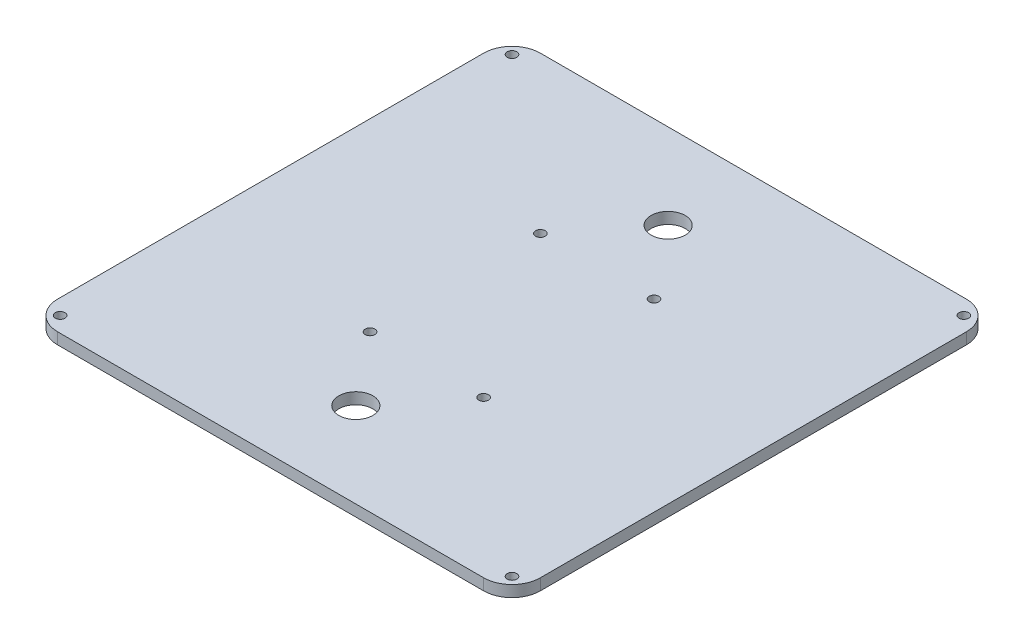
ISO-10303-21;
HEADER;
FILE_DESCRIPTION(('STEP AP214'),'2;1');
FILE_NAME('part.step','',(''),(''),'','','');
FILE_SCHEMA(('AUTOMOTIVE_DESIGN { 1 0 10303 214 1 1 1 1 }'));
ENDSEC;
DATA;
#1=APPLICATION_CONTEXT('core data for automotive mechanical design processes');
#2=APPLICATION_PROTOCOL_DEFINITION('international standard','automotive_design',2000,#1);
#3=PRODUCT_CONTEXT('',#1,'mechanical');
#4=PRODUCT('Part','Part','',(#3));
#5=PRODUCT_RELATED_PRODUCT_CATEGORY('part','',(#4));
#6=PRODUCT_DEFINITION_FORMATION('','',#4);
#7=PRODUCT_DEFINITION_CONTEXT('part definition',#1,'design');
#8=PRODUCT_DEFINITION('design','',#6,#7);
#9=PRODUCT_DEFINITION_SHAPE('','',#8);
#10=(LENGTH_UNIT() NAMED_UNIT(*) SI_UNIT(.MILLI.,.METRE.));
#11=(NAMED_UNIT(*) PLANE_ANGLE_UNIT() SI_UNIT($,.RADIAN.));
#12=(NAMED_UNIT(*) SI_UNIT($,.STERADIAN.) SOLID_ANGLE_UNIT());
#13=UNCERTAINTY_MEASURE_WITH_UNIT(LENGTH_MEASURE(1.E-05),#10,'distance_accuracy_value','');
#14=(GEOMETRIC_REPRESENTATION_CONTEXT(3) GLOBAL_UNCERTAINTY_ASSIGNED_CONTEXT((#13)) GLOBAL_UNIT_ASSIGNED_CONTEXT((#10,
#11,#12)) REPRESENTATION_CONTEXT('',''));
#15=CARTESIAN_POINT('',(0.,0.,0.));
#16=DIRECTION('',(0.,0.,1.));
#17=DIRECTION('',(1.,0.,0.));
#18=AXIS2_PLACEMENT_3D('',#15,#16,#17);
#19=CARTESIAN_POINT('',(7.4,110.,-162.6));
#20=DIRECTION('',(-1.,0.,0.));
#21=DIRECTION('',(0.,0.,1.));
#22=AXIS2_PLACEMENT_3D('',#19,#20,#21);
#23=PLANE('',#22);
#24=DIRECTION('',(0.,0.,1.));
#25=VECTOR('',#24,1.);
#26=CARTESIAN_POINT('',(7.4,110.,-162.6));
#27=LINE('',#26,#25);
#28=CARTESIAN_POINT('',(7.4,110.,-162.6));
#29=VERTEX_POINT('',#28);
#30=CARTESIAN_POINT('',(7.4,110.,-7.4));
#31=VERTEX_POINT('',#30);
#32=EDGE_CURVE('E231',#29,#31,#27,.T.);
#33=ORIENTED_EDGE('',*,*,#32,.T.);
#34=DIRECTION('',(0.,-1.,0.));
#35=VECTOR('',#34,1.);
#36=CARTESIAN_POINT('',(7.4,110.,-7.4));
#37=LINE('',#36,#35);
#38=CARTESIAN_POINT('',(7.4,107.,-7.4));
#39=VERTEX_POINT('',#38);
#40=EDGE_CURVE('E39',#31,#39,#37,.T.);
#41=ORIENTED_EDGE('',*,*,#40,.T.);
#42=DIRECTION('',(0.,0.,1.));
#43=VECTOR('',#42,1.);
#44=CARTESIAN_POINT('',(7.4,107.,-162.6));
#45=LINE('',#44,#43);
#46=CARTESIAN_POINT('',(7.4,107.,-162.6));
#47=VERTEX_POINT('',#46);
#48=EDGE_CURVE('E220',#47,#39,#45,.T.);
#49=ORIENTED_EDGE('',*,*,#48,.F.);
#50=DIRECTION('',(0.,-1.,0.));
#51=VECTOR('',#50,1.);
#52=CARTESIAN_POINT('',(7.4,110.,-162.6));
#53=LINE('',#52,#51);
#54=EDGE_CURVE('E11',#29,#47,#53,.T.);
#55=ORIENTED_EDGE('',*,*,#54,.F.);
#56=EDGE_LOOP('',(#33,#41,#49,#55));
#57=FACE_BOUND('',#56,.T.);
#58=ADVANCED_FACE('F17',(#57),#23,.F.);
#59=CARTESIAN_POINT('',(162.6,110.,-162.6));
#60=DIRECTION('',(0.,0.,-1.));
#61=DIRECTION('',(-1.,0.,0.));
#62=AXIS2_PLACEMENT_3D('',#59,#60,#61);
#63=PLANE('',#62);
#64=DIRECTION('',(-1.,0.,0.));
#65=VECTOR('',#64,1.);
#66=CARTESIAN_POINT('',(162.6,110.,-162.6));
#67=LINE('',#66,#65);
#68=CARTESIAN_POINT('',(162.6,110.,-162.6));
#69=VERTEX_POINT('',#68);
#70=EDGE_CURVE('E221',#69,#29,#67,.T.);
#71=ORIENTED_EDGE('',*,*,#70,.T.);
#72=ORIENTED_EDGE('',*,*,#54,.T.);
#73=DIRECTION('',(-1.,0.,0.));
#74=VECTOR('',#73,1.);
#75=CARTESIAN_POINT('',(162.6,107.,-162.6));
#76=LINE('',#75,#74);
#77=CARTESIAN_POINT('',(162.6,107.,-162.6));
#78=VERTEX_POINT('',#77);
#79=EDGE_CURVE('E216',#78,#47,#76,.T.);
#80=ORIENTED_EDGE('',*,*,#79,.F.);
#81=DIRECTION('',(0.,-1.,0.));
#82=VECTOR('',#81,1.);
#83=CARTESIAN_POINT('',(162.6,110.,-162.6));
#84=LINE('',#83,#82);
#85=EDGE_CURVE('E27',#69,#78,#84,.T.);
#86=ORIENTED_EDGE('',*,*,#85,.F.);
#87=EDGE_LOOP('',(#71,#72,#80,#86));
#88=FACE_BOUND('',#87,.T.);
#89=ADVANCED_FACE('F904',(#88),#63,.F.);
#90=CARTESIAN_POINT('',(162.6,110.,-7.4));
#91=DIRECTION('',(1.,0.,0.));
#92=DIRECTION('',(0.,1.,0.));
#93=AXIS2_PLACEMENT_3D('',#90,#91,#92);
#94=PLANE('',#93);
#95=DIRECTION('',(0.,0.,-1.));
#96=VECTOR('',#95,1.);
#97=CARTESIAN_POINT('',(162.6,110.,-7.4));
#98=LINE('',#97,#96);
#99=CARTESIAN_POINT('',(162.6,110.,-7.4));
#100=VERTEX_POINT('',#99);
#101=EDGE_CURVE('E223',#100,#69,#98,.T.);
#102=ORIENTED_EDGE('',*,*,#101,.T.);
#103=ORIENTED_EDGE('',*,*,#85,.T.);
#104=DIRECTION('',(0.,0.,-1.));
#105=VECTOR('',#104,1.);
#106=CARTESIAN_POINT('',(162.6,107.,-7.4));
#107=LINE('',#106,#105);
#108=CARTESIAN_POINT('',(162.6,107.,-7.4));
#109=VERTEX_POINT('',#108);
#110=EDGE_CURVE('E215',#109,#78,#107,.T.);
#111=ORIENTED_EDGE('',*,*,#110,.F.);
#112=DIRECTION('',(0.,-1.,0.));
#113=VECTOR('',#112,1.);
#114=CARTESIAN_POINT('',(162.6,110.,-7.4));
#115=LINE('',#114,#113);
#116=EDGE_CURVE('E62',#100,#109,#115,.T.);
#117=ORIENTED_EDGE('',*,*,#116,.F.);
#118=EDGE_LOOP('',(#102,#103,#111,#117));
#119=FACE_BOUND('',#118,.T.);
#120=ADVANCED_FACE('F907',(#119),#94,.F.);
#121=CARTESIAN_POINT('',(7.4,110.,-7.4));
#122=DIRECTION('',(0.,0.,1.));
#123=DIRECTION('',(0.,-1.,0.));
#124=AXIS2_PLACEMENT_3D('',#121,#122,#123);
#125=PLANE('',#124);
#126=DIRECTION('',(1.,0.,0.));
#127=VECTOR('',#126,1.);
#128=CARTESIAN_POINT('',(7.4,110.,-7.4));
#129=LINE('',#128,#127);
#130=EDGE_CURVE('E229',#31,#100,#129,.T.);
#131=ORIENTED_EDGE('',*,*,#130,.T.);
#132=ORIENTED_EDGE('',*,*,#116,.T.);
#133=DIRECTION('',(1.,0.,0.));
#134=VECTOR('',#133,1.);
#135=CARTESIAN_POINT('',(7.4,107.,-7.4));
#136=LINE('',#135,#134);
#137=EDGE_CURVE('E222',#39,#109,#136,.T.);
#138=ORIENTED_EDGE('',*,*,#137,.F.);
#139=ORIENTED_EDGE('',*,*,#40,.F.);
#140=EDGE_LOOP('',(#131,#132,#138,#139));
#141=FACE_BOUND('',#140,.T.);
#142=ADVANCED_FACE('F920',(#141),#125,.F.);
#143=CARTESIAN_POINT('',(85.,110.,-85.));
#144=DIRECTION('',(0.,1.,0.));
#145=DIRECTION('',(0.,0.,-1.));
#146=AXIS2_PLACEMENT_3D('',#143,#144,#145);
#147=PLANE('',#146);
#148=CARTESIAN_POINT('',(85.,110.,-140.));
#149=DIRECTION('',(0.,-1.,0.));
#150=DIRECTION('',(1.,0.,0.));
#151=AXIS2_PLACEMENT_3D('',#148,#149,#150);
#152=CIRCLE('',#151,6.);
#153=CARTESIAN_POINT('',(91.,110.,-140.));
#154=VERTEX_POINT('',#153);
#155=EDGE_CURVE('E206',#154,#154,#152,.T.);
#156=ORIENTED_EDGE('',*,*,#155,.F.);
#157=EDGE_LOOP('',(#156));
#158=FACE_BOUND('',#157,.T.);
#159=CARTESIAN_POINT('',(105.,110.,-115.));
#160=DIRECTION('',(0.,1.,0.));
#161=DIRECTION('',(1.,0.,0.));
#162=AXIS2_PLACEMENT_3D('',#159,#160,#161);
#163=CIRCLE('',#162,1.7);
#164=CARTESIAN_POINT('',(106.7,110.,-115.));
#165=VERTEX_POINT('',#164);
#166=EDGE_CURVE('E209',#165,#165,#163,.T.);
#167=ORIENTED_EDGE('',*,*,#166,.T.);
#168=EDGE_LOOP('',(#167));
#169=FACE_BOUND('',#168,.T.);
#170=CARTESIAN_POINT('',(65.,110.,-115.));
#171=DIRECTION('',(0.,1.,0.));
#172=DIRECTION('',(1.,0.,0.));
#173=AXIS2_PLACEMENT_3D('',#170,#171,#172);
#174=CIRCLE('',#173,1.7);
#175=CARTESIAN_POINT('',(66.7,110.,-115.));
#176=VERTEX_POINT('',#175);
#177=EDGE_CURVE('E200',#176,#176,#174,.T.);
#178=ORIENTED_EDGE('',*,*,#177,.T.);
#179=EDGE_LOOP('',(#178));
#180=FACE_BOUND('',#179,.T.);
#181=CARTESIAN_POINT('',(105.,110.,-55.));
#182=DIRECTION('',(0.,1.,0.));
#183=DIRECTION('',(1.,0.,0.));
#184=AXIS2_PLACEMENT_3D('',#181,#182,#183);
#185=CIRCLE('',#184,1.7);
#186=CARTESIAN_POINT('',(106.7,110.,-55.));
#187=VERTEX_POINT('',#186);
#188=EDGE_CURVE('E184',#187,#187,#185,.T.);
#189=ORIENTED_EDGE('',*,*,#188,.T.);
#190=EDGE_LOOP('',(#189));
#191=FACE_BOUND('',#190,.T.);
#192=CARTESIAN_POINT('',(85.,110.,-30.));
#193=DIRECTION('',(0.,-1.,0.));
#194=DIRECTION('',(1.,0.,0.));
#195=AXIS2_PLACEMENT_3D('',#192,#193,#194);
#196=CIRCLE('',#195,6.);
#197=CARTESIAN_POINT('',(91.,110.,-30.));
#198=VERTEX_POINT('',#197);
#199=EDGE_CURVE('E393',#198,#198,#196,.T.);
#200=ORIENTED_EDGE('',*,*,#199,.F.);
#201=EDGE_LOOP('',(#200));
#202=FACE_BOUND('',#201,.T.);
#203=CARTESIAN_POINT('',(65.,110.,-55.));
#204=DIRECTION('',(0.,1.,0.));
#205=DIRECTION('',(1.,0.,0.));
#206=AXIS2_PLACEMENT_3D('',#203,#204,#205);
#207=CIRCLE('',#206,1.7);
#208=CARTESIAN_POINT('',(66.7,110.,-55.));
#209=VERTEX_POINT('',#208);
#210=EDGE_CURVE('E179',#209,#209,#207,.T.);
#211=ORIENTED_EDGE('',*,*,#210,.T.);
#212=EDGE_LOOP('',(#211));
#213=FACE_BOUND('',#212,.T.);
#214=ORIENTED_EDGE('',*,*,#70,.F.);
#215=ORIENTED_EDGE('',*,*,#101,.F.);
#216=ORIENTED_EDGE('',*,*,#130,.F.);
#217=ORIENTED_EDGE('',*,*,#32,.F.);
#218=EDGE_LOOP('',(#214,#215,#216,#217));
#219=FACE_BOUND('',#218,.T.);
#220=ADVANCED_FACE('F186',(#158,#169,#180,#191,#202,#213,#219),#147,.F.);
#221=CARTESIAN_POINT('',(85.,107.,-85.));
#222=DIRECTION('',(0.,1.,0.));
#223=DIRECTION('',(0.,0.,-1.));
#224=AXIS2_PLACEMENT_3D('',#221,#222,#223);
#225=PLANE('',#224);
#226=ORIENTED_EDGE('',*,*,#110,.T.);
#227=ORIENTED_EDGE('',*,*,#79,.T.);
#228=ORIENTED_EDGE('',*,*,#48,.T.);
#229=ORIENTED_EDGE('',*,*,#137,.T.);
#230=EDGE_LOOP('',(#226,#227,#228,#229));
#231=FACE_BOUND('',#230,.T.);
#232=CARTESIAN_POINT('',(11.4,107.,-11.4));
#233=DIRECTION('',(0.,-1.,0.));
#234=DIRECTION('',(0.,0.,-1.));
#235=AXIS2_PLACEMENT_3D('',#232,#233,#234);
#236=CIRCLE('',#235,6.);
#237=CARTESIAN_POINT('',(11.4,107.,-5.4));
#238=VERTEX_POINT('',#237);
#239=CARTESIAN_POINT('',(5.4,107.,-11.4));
#240=VERTEX_POINT('',#239);
#241=EDGE_CURVE('E363',#238,#240,#236,.T.);
#242=ORIENTED_EDGE('',*,*,#241,.T.);
#243=DIRECTION('',(0.,0.,1.));
#244=VECTOR('',#243,1.);
#245=CARTESIAN_POINT('',(5.4,107.,-164.6));
#246=LINE('',#245,#244);
#247=CARTESIAN_POINT('',(5.4,107.,-158.6));
#248=VERTEX_POINT('',#247);
#249=EDGE_CURVE('E366',#248,#240,#246,.T.);
#250=ORIENTED_EDGE('',*,*,#249,.F.);
#251=CARTESIAN_POINT('',(11.4,107.,-158.6));
#252=DIRECTION('',(0.,1.,0.));
#253=DIRECTION('',(0.,0.,-1.));
#254=AXIS2_PLACEMENT_3D('',#251,#252,#253);
#255=CIRCLE('',#254,6.);
#256=CARTESIAN_POINT('',(11.4,107.,-164.6));
#257=VERTEX_POINT('',#256);
#258=EDGE_CURVE('E378',#257,#248,#255,.T.);
#259=ORIENTED_EDGE('',*,*,#258,.F.);
#260=DIRECTION('',(-1.,0.,0.));
#261=VECTOR('',#260,1.);
#262=CARTESIAN_POINT('',(164.6,107.,-164.6));
#263=LINE('',#262,#261);
#264=CARTESIAN_POINT('',(158.6,107.,-164.6));
#265=VERTEX_POINT('',#264);
#266=EDGE_CURVE('E272',#265,#257,#263,.T.);
#267=ORIENTED_EDGE('',*,*,#266,.F.);
#268=CARTESIAN_POINT('',(158.6,107.,-158.6));
#269=DIRECTION('',(0.,1.,0.));
#270=DIRECTION('',(0.,0.,-1.));
#271=AXIS2_PLACEMENT_3D('',#268,#269,#270);
#272=CIRCLE('',#271,6.);
#273=CARTESIAN_POINT('',(164.6,107.,-158.6));
#274=VERTEX_POINT('',#273);
#275=EDGE_CURVE('E381',#274,#265,#272,.T.);
#276=ORIENTED_EDGE('',*,*,#275,.F.);
#277=DIRECTION('',(0.,0.,-1.));
#278=VECTOR('',#277,1.);
#279=CARTESIAN_POINT('',(164.6,107.,-5.4));
#280=LINE('',#279,#278);
#281=CARTESIAN_POINT('',(164.6,107.,-11.4));
#282=VERTEX_POINT('',#281);
#283=EDGE_CURVE('E369',#282,#274,#280,.T.);
#284=ORIENTED_EDGE('',*,*,#283,.F.);
#285=CARTESIAN_POINT('',(158.6,107.,-11.4));
#286=DIRECTION('',(0.,1.,0.));
#287=DIRECTION('',(0.,0.,-1.));
#288=AXIS2_PLACEMENT_3D('',#285,#286,#287);
#289=CIRCLE('',#288,6.);
#290=CARTESIAN_POINT('',(158.6,107.,-5.4));
#291=VERTEX_POINT('',#290);
#292=EDGE_CURVE('E292',#291,#282,#289,.T.);
#293=ORIENTED_EDGE('',*,*,#292,.F.);
#294=DIRECTION('',(1.,0.,0.));
#295=VECTOR('',#294,1.);
#296=CARTESIAN_POINT('',(5.4,107.,-5.4));
#297=LINE('',#296,#295);
#298=EDGE_CURVE('E338',#238,#291,#297,.T.);
#299=ORIENTED_EDGE('',*,*,#298,.F.);
#300=EDGE_LOOP('',(#242,#250,#259,#267,#276,#284,#293,#299));
#301=FACE_BOUND('',#300,.T.);
#302=ADVANCED_FACE('F922',(#231,#301),#225,.F.);
#303=CARTESIAN_POINT('',(105.,110.,-115.));
#304=DIRECTION('',(0.,-1.,0.));
#305=DIRECTION('',(1.,0.,0.));
#306=AXIS2_PLACEMENT_3D('',#303,#304,#305);
#307=CYLINDRICAL_SURFACE('',#306,1.7);
#308=DIRECTION('',(0.,1.,0.));
#309=VECTOR('',#308,1.);
#310=CARTESIAN_POINT('',(106.7,110.,-115.));
#311=LINE('',#310,#309);
#312=CARTESIAN_POINT('',(106.7,114.,-115.));
#313=VERTEX_POINT('',#312);
#314=EDGE_CURVE('E210',#165,#313,#311,.T.);
#315=ORIENTED_EDGE('',*,*,#314,.T.);
#316=CARTESIAN_POINT('',(105.,114.,-115.));
#317=DIRECTION('',(0.,1.,0.));
#318=DIRECTION('',(1.,0.,0.));
#319=AXIS2_PLACEMENT_3D('',#316,#317,#318);
#320=CIRCLE('',#319,1.7);
#321=EDGE_CURVE('E328',#313,#313,#320,.T.);
#322=ORIENTED_EDGE('',*,*,#321,.T.);
#323=ORIENTED_EDGE('',*,*,#314,.F.);
#324=ORIENTED_EDGE('',*,*,#166,.F.);
#325=EDGE_LOOP('',(#315,#322,#323,#324));
#326=FACE_BOUND('',#325,.T.);
#327=ADVANCED_FACE('F948',(#326),#307,.F.);
#328=CARTESIAN_POINT('',(85.,107.,-140.));
#329=DIRECTION('',(0.,-1.,0.));
#330=DIRECTION('',(1.,0.,0.));
#331=AXIS2_PLACEMENT_3D('',#328,#329,#330);
#332=CYLINDRICAL_SURFACE('',#331,6.);
#333=ORIENTED_EDGE('',*,*,#155,.T.);
#334=DIRECTION('',(0.,1.,0.));
#335=VECTOR('',#334,1.);
#336=CARTESIAN_POINT('',(91.,107.,-140.));
#337=LINE('',#336,#335);
#338=CARTESIAN_POINT('',(91.,114.,-140.));
#339=VERTEX_POINT('',#338);
#340=EDGE_CURVE('E211',#154,#339,#337,.T.);
#341=ORIENTED_EDGE('',*,*,#340,.T.);
#342=CARTESIAN_POINT('',(85.,114.,-140.));
#343=DIRECTION('',(0.,1.,0.));
#344=DIRECTION('',(1.,0.,0.));
#345=AXIS2_PLACEMENT_3D('',#342,#343,#344);
#346=CIRCLE('',#345,6.);
#347=EDGE_CURVE('E324',#339,#339,#346,.T.);
#348=ORIENTED_EDGE('',*,*,#347,.T.);
#349=ORIENTED_EDGE('',*,*,#340,.F.);
#350=EDGE_LOOP('',(#333,#341,#348,#349));
#351=FACE_BOUND('',#350,.T.);
#352=ADVANCED_FACE('F753',(#351),#332,.F.);
#353=CARTESIAN_POINT('',(65.,110.,-115.));
#354=DIRECTION('',(0.,-1.,0.));
#355=DIRECTION('',(1.,0.,0.));
#356=AXIS2_PLACEMENT_3D('',#353,#354,#355);
#357=CYLINDRICAL_SURFACE('',#356,1.7);
#358=DIRECTION('',(0.,1.,0.));
#359=VECTOR('',#358,1.);
#360=CARTESIAN_POINT('',(66.7,110.,-115.));
#361=LINE('',#360,#359);
#362=CARTESIAN_POINT('',(66.7,114.,-115.));
#363=VERTEX_POINT('',#362);
#364=EDGE_CURVE('E191',#176,#363,#361,.T.);
#365=ORIENTED_EDGE('',*,*,#364,.T.);
#366=CARTESIAN_POINT('',(65.,114.,-115.));
#367=DIRECTION('',(0.,1.,0.));
#368=DIRECTION('',(1.,0.,0.));
#369=AXIS2_PLACEMENT_3D('',#366,#367,#368);
#370=CIRCLE('',#369,1.7);
#371=EDGE_CURVE('E320',#363,#363,#370,.T.);
#372=ORIENTED_EDGE('',*,*,#371,.T.);
#373=ORIENTED_EDGE('',*,*,#364,.F.);
#374=ORIENTED_EDGE('',*,*,#177,.F.);
#375=EDGE_LOOP('',(#365,#372,#373,#374));
#376=FACE_BOUND('',#375,.T.);
#377=ADVANCED_FACE('F942',(#376),#357,.F.);
#378=CARTESIAN_POINT('',(105.,110.,-55.));
#379=DIRECTION('',(0.,-1.,0.));
#380=DIRECTION('',(1.,0.,0.));
#381=AXIS2_PLACEMENT_3D('',#378,#379,#380);
#382=CYLINDRICAL_SURFACE('',#381,1.7);
#383=DIRECTION('',(0.,1.,0.));
#384=VECTOR('',#383,1.);
#385=CARTESIAN_POINT('',(106.7,110.,-55.));
#386=LINE('',#385,#384);
#387=CARTESIAN_POINT('',(106.7,114.,-55.));
#388=VERTEX_POINT('',#387);
#389=EDGE_CURVE('E195',#187,#388,#386,.T.);
#390=ORIENTED_EDGE('',*,*,#389,.T.);
#391=CARTESIAN_POINT('',(105.,114.,-55.));
#392=DIRECTION('',(0.,1.,0.));
#393=DIRECTION('',(1.,0.,0.));
#394=AXIS2_PLACEMENT_3D('',#391,#392,#393);
#395=CIRCLE('',#394,1.7);
#396=EDGE_CURVE('E311',#388,#388,#395,.T.);
#397=ORIENTED_EDGE('',*,*,#396,.T.);
#398=ORIENTED_EDGE('',*,*,#389,.F.);
#399=ORIENTED_EDGE('',*,*,#188,.F.);
#400=EDGE_LOOP('',(#390,#397,#398,#399));
#401=FACE_BOUND('',#400,.T.);
#402=ADVANCED_FACE('F939',(#401),#382,.F.);
#403=CARTESIAN_POINT('',(65.,110.,-55.));
#404=DIRECTION('',(0.,-1.,0.));
#405=DIRECTION('',(1.,0.,0.));
#406=AXIS2_PLACEMENT_3D('',#403,#404,#405);
#407=CYLINDRICAL_SURFACE('',#406,1.7);
#408=DIRECTION('',(0.,1.,0.));
#409=VECTOR('',#408,1.);
#410=CARTESIAN_POINT('',(66.7,110.,-55.));
#411=LINE('',#410,#409);
#412=CARTESIAN_POINT('',(66.7,114.,-55.));
#413=VERTEX_POINT('',#412);
#414=EDGE_CURVE('E405',#209,#413,#411,.T.);
#415=ORIENTED_EDGE('',*,*,#414,.T.);
#416=CARTESIAN_POINT('',(65.,114.,-55.));
#417=DIRECTION('',(0.,1.,0.));
#418=DIRECTION('',(1.,0.,0.));
#419=AXIS2_PLACEMENT_3D('',#416,#417,#418);
#420=CIRCLE('',#419,1.7);
#421=EDGE_CURVE('E305',#413,#413,#420,.T.);
#422=ORIENTED_EDGE('',*,*,#421,.T.);
#423=ORIENTED_EDGE('',*,*,#414,.F.);
#424=ORIENTED_EDGE('',*,*,#210,.F.);
#425=EDGE_LOOP('',(#415,#422,#423,#424));
#426=FACE_BOUND('',#425,.T.);
#427=ADVANCED_FACE('F933',(#426),#407,.F.);
#428=CARTESIAN_POINT('',(85.,107.,-30.));
#429=DIRECTION('',(0.,-1.,0.));
#430=DIRECTION('',(1.,0.,0.));
#431=AXIS2_PLACEMENT_3D('',#428,#429,#430);
#432=CYLINDRICAL_SURFACE('',#431,6.);
#433=ORIENTED_EDGE('',*,*,#199,.T.);
#434=DIRECTION('',(0.,1.,0.));
#435=VECTOR('',#434,1.);
#436=CARTESIAN_POINT('',(91.,107.,-30.));
#437=LINE('',#436,#435);
#438=CARTESIAN_POINT('',(91.,114.,-30.));
#439=VERTEX_POINT('',#438);
#440=EDGE_CURVE('E398',#198,#439,#437,.T.);
#441=ORIENTED_EDGE('',*,*,#440,.T.);
#442=CARTESIAN_POINT('',(85.,114.,-30.));
#443=DIRECTION('',(0.,1.,0.));
#444=DIRECTION('',(1.,0.,0.));
#445=AXIS2_PLACEMENT_3D('',#442,#443,#444);
#446=CIRCLE('',#445,6.);
#447=EDGE_CURVE('E297',#439,#439,#446,.T.);
#448=ORIENTED_EDGE('',*,*,#447,.T.);
#449=ORIENTED_EDGE('',*,*,#440,.F.);
#450=EDGE_LOOP('',(#433,#441,#448,#449));
#451=FACE_BOUND('',#450,.T.);
#452=ADVANCED_FACE('F931',(#451),#432,.F.);
#453=CARTESIAN_POINT('',(164.57106781186,110.,-164.5710678118));
#454=DIRECTION('',(0.,-1.,0.));
#455=DIRECTION('',(1.,0.,0.));
#456=AXIS2_PLACEMENT_3D('',#453,#454,#455);
#457=CYLINDRICAL_SURFACE('',#456,1.7);
#458=DIRECTION('',(0.,1.,0.));
#459=VECTOR('',#458,1.);
#460=CARTESIAN_POINT('',(166.27106781186,110.,-164.5710678118));
#461=LINE('',#460,#459);
#462=CARTESIAN_POINT('',(166.27106781186,110.,-164.5710678118));
#463=VERTEX_POINT('',#462);
#464=CARTESIAN_POINT('',(166.27106781186,114.,-164.5710678118));
#465=VERTEX_POINT('',#464);
#466=EDGE_CURVE('E391',#463,#465,#461,.T.);
#467=ORIENTED_EDGE('',*,*,#466,.T.);
#468=CARTESIAN_POINT('',(164.57106781186,114.,-164.5710678118));
#469=DIRECTION('',(0.,1.,0.));
#470=DIRECTION('',(1.,0.,0.));
#471=AXIS2_PLACEMENT_3D('',#468,#469,#470);
#472=CIRCLE('',#471,1.7);
#473=EDGE_CURVE('E334',#465,#465,#472,.T.);
#474=ORIENTED_EDGE('',*,*,#473,.T.);
#475=ORIENTED_EDGE('',*,*,#466,.F.);
#476=CARTESIAN_POINT('',(164.57106781186,110.,-164.5710678118));
#477=DIRECTION('',(0.,1.,0.));
#478=DIRECTION('',(1.,0.,0.));
#479=AXIS2_PLACEMENT_3D('',#476,#477,#478);
#480=CIRCLE('',#479,1.7);
#481=EDGE_CURVE('E578',#463,#463,#480,.T.);
#482=ORIENTED_EDGE('',*,*,#481,.F.);
#483=EDGE_LOOP('',(#467,#474,#475,#482));
#484=FACE_BOUND('',#483,.T.);
#485=ADVANCED_FACE('F927',(#484),#457,.F.);
#486=CARTESIAN_POINT('',(5.428932188135,110.,-164.5710678118));
#487=DIRECTION('',(0.,-1.,0.));
#488=DIRECTION('',(1.,0.,0.));
#489=AXIS2_PLACEMENT_3D('',#486,#487,#488);
#490=CYLINDRICAL_SURFACE('',#489,1.7);
#491=DIRECTION('',(0.,1.,0.));
#492=VECTOR('',#491,1.);
#493=CARTESIAN_POINT('',(7.128932188135,110.,-164.5710678118));
#494=LINE('',#493,#492);
#495=CARTESIAN_POINT('',(7.128932188135,110.,-164.5710678118));
#496=VERTEX_POINT('',#495);
#497=CARTESIAN_POINT('',(7.128932188135,114.,-164.5710678118));
#498=VERTEX_POINT('',#497);
#499=EDGE_CURVE('E275',#496,#498,#494,.T.);
#500=ORIENTED_EDGE('',*,*,#499,.T.);
#501=CARTESIAN_POINT('',(5.428932188135,114.,-164.5710678118));
#502=DIRECTION('',(0.,1.,0.));
#503=DIRECTION('',(1.,0.,0.));
#504=AXIS2_PLACEMENT_3D('',#501,#502,#503);
#505=CIRCLE('',#504,1.7);
#506=EDGE_CURVE('E321',#498,#498,#505,.T.);
#507=ORIENTED_EDGE('',*,*,#506,.T.);
#508=ORIENTED_EDGE('',*,*,#499,.F.);
#509=CARTESIAN_POINT('',(5.428932188135,110.,-164.5710678118));
#510=DIRECTION('',(0.,1.,0.));
#511=DIRECTION('',(1.,0.,0.));
#512=AXIS2_PLACEMENT_3D('',#509,#510,#511);
#513=CIRCLE('',#512,1.7);
#514=EDGE_CURVE('E581',#496,#496,#513,.T.);
#515=ORIENTED_EDGE('',*,*,#514,.F.);
#516=EDGE_LOOP('',(#500,#507,#508,#515));
#517=FACE_BOUND('',#516,.T.);
#518=ADVANCED_FACE('F849',(#517),#490,.F.);
#519=CARTESIAN_POINT('',(164.57106781186,110.,-5.428932188135));
#520=DIRECTION('',(0.,-1.,0.));
#521=DIRECTION('',(1.,0.,0.));
#522=AXIS2_PLACEMENT_3D('',#519,#520,#521);
#523=CYLINDRICAL_SURFACE('',#522,1.7);
#524=DIRECTION('',(0.,1.,0.));
#525=VECTOR('',#524,1.);
#526=CARTESIAN_POINT('',(166.27106781186,110.,-5.428932188135));
#527=LINE('',#526,#525);
#528=CARTESIAN_POINT('',(166.27106781186,110.,-5.428932188135));
#529=VERTEX_POINT('',#528);
#530=CARTESIAN_POINT('',(166.27106781186,114.,-5.428932188135));
#531=VERTEX_POINT('',#530);
#532=EDGE_CURVE('E267',#529,#531,#527,.T.);
#533=ORIENTED_EDGE('',*,*,#532,.T.);
#534=CARTESIAN_POINT('',(164.57106781186,114.,-5.428932188135));
#535=DIRECTION('',(0.,1.,0.));
#536=DIRECTION('',(1.,0.,0.));
#537=AXIS2_PLACEMENT_3D('',#534,#535,#536);
#538=CIRCLE('',#537,1.7);
#539=EDGE_CURVE('E310',#531,#531,#538,.T.);
#540=ORIENTED_EDGE('',*,*,#539,.T.);
#541=ORIENTED_EDGE('',*,*,#532,.F.);
#542=CARTESIAN_POINT('',(164.57106781186,110.,-5.428932188135));
#543=DIRECTION('',(0.,1.,0.));
#544=DIRECTION('',(1.,0.,0.));
#545=AXIS2_PLACEMENT_3D('',#542,#543,#544);
#546=CIRCLE('',#545,1.7);
#547=EDGE_CURVE('E589',#529,#529,#546,.T.);
#548=ORIENTED_EDGE('',*,*,#547,.F.);
#549=EDGE_LOOP('',(#533,#540,#541,#548));
#550=FACE_BOUND('',#549,.T.);
#551=ADVANCED_FACE('F1008',(#550),#523,.F.);
#552=CARTESIAN_POINT('',(164.6,110.,-164.6));
#553=DIRECTION('',(0.,0.,-1.));
#554=DIRECTION('',(-1.,0.,0.));
#555=AXIS2_PLACEMENT_3D('',#552,#553,#554);
#556=PLANE('',#555);
#557=DIRECTION('',(-1.,0.,0.));
#558=VECTOR('',#557,1.);
#559=CARTESIAN_POINT('',(164.6,110.,-164.6));
#560=LINE('',#559,#558);
#561=CARTESIAN_POINT('',(158.6,110.,-164.6));
#562=VERTEX_POINT('',#561);
#563=CARTESIAN_POINT('',(11.4,110.,-164.6));
#564=VERTEX_POINT('',#563);
#565=EDGE_CURVE('E623',#562,#564,#560,.T.);
#566=ORIENTED_EDGE('',*,*,#565,.F.);
#567=DIRECTION('',(0.,-1.,0.));
#568=VECTOR('',#567,1.);
#569=CARTESIAN_POINT('',(158.6,110.,-164.6));
#570=LINE('',#569,#568);
#571=EDGE_CURVE('E384',#562,#265,#570,.T.);
#572=ORIENTED_EDGE('',*,*,#571,.T.);
#573=ORIENTED_EDGE('',*,*,#266,.T.);
#574=DIRECTION('',(0.,-1.,0.));
#575=VECTOR('',#574,1.);
#576=CARTESIAN_POINT('',(11.4,110.,-164.6));
#577=LINE('',#576,#575);
#578=EDGE_CURVE('E380',#564,#257,#577,.T.);
#579=ORIENTED_EDGE('',*,*,#578,.F.);
#580=EDGE_LOOP('',(#566,#572,#573,#579));
#581=FACE_BOUND('',#580,.T.);
#582=ADVANCED_FACE('F975',(#581),#556,.T.);
#583=CARTESIAN_POINT('',(158.6,110.,-158.6));
#584=DIRECTION('',(0.,-1.,0.));
#585=DIRECTION('',(1.,0.,0.));
#586=AXIS2_PLACEMENT_3D('',#583,#584,#585);
#587=CYLINDRICAL_SURFACE('',#586,6.);
#588=DIRECTION('',(0.,-1.,0.));
#589=VECTOR('',#588,1.);
#590=CARTESIAN_POINT('',(164.6,110.,-158.6));
#591=LINE('',#590,#589);
#592=CARTESIAN_POINT('',(164.6,110.,-158.6));
#593=VERTEX_POINT('',#592);
#594=EDGE_CURVE('E373',#593,#274,#591,.T.);
#595=ORIENTED_EDGE('',*,*,#594,.T.);
#596=ORIENTED_EDGE('',*,*,#275,.T.);
#597=ORIENTED_EDGE('',*,*,#571,.F.);
#598=CARTESIAN_POINT('',(158.6,110.,-158.6));
#599=DIRECTION('',(0.,1.,0.));
#600=DIRECTION('',(0.,0.,-1.));
#601=AXIS2_PLACEMENT_3D('',#598,#599,#600);
#602=CIRCLE('',#601,6.);
#603=EDGE_CURVE('E631',#593,#562,#602,.T.);
#604=ORIENTED_EDGE('',*,*,#603,.F.);
#605=EDGE_LOOP('',(#595,#596,#597,#604));
#606=FACE_BOUND('',#605,.T.);
#607=ADVANCED_FACE('F972',(#606),#587,.T.);
#608=CARTESIAN_POINT('',(11.4,110.,-158.6));
#609=DIRECTION('',(0.,-1.,0.));
#610=DIRECTION('',(0.,0.,-1.));
#611=AXIS2_PLACEMENT_3D('',#608,#609,#610);
#612=CYLINDRICAL_SURFACE('',#611,6.);
#613=ORIENTED_EDGE('',*,*,#578,.T.);
#614=ORIENTED_EDGE('',*,*,#258,.T.);
#615=DIRECTION('',(0.,-1.,0.));
#616=VECTOR('',#615,1.);
#617=CARTESIAN_POINT('',(5.4,110.,-158.6));
#618=LINE('',#617,#616);
#619=CARTESIAN_POINT('',(5.4,110.,-158.6));
#620=VERTEX_POINT('',#619);
#621=EDGE_CURVE('E293',#620,#248,#618,.T.);
#622=ORIENTED_EDGE('',*,*,#621,.F.);
#623=CARTESIAN_POINT('',(11.4,110.,-158.6));
#624=DIRECTION('',(0.,1.,0.));
#625=DIRECTION('',(0.,0.,-1.));
#626=AXIS2_PLACEMENT_3D('',#623,#624,#625);
#627=CIRCLE('',#626,6.);
#628=EDGE_CURVE('E616',#564,#620,#627,.T.);
#629=ORIENTED_EDGE('',*,*,#628,.F.);
#630=EDGE_LOOP('',(#613,#614,#622,#629));
#631=FACE_BOUND('',#630,.T.);
#632=ADVANCED_FACE('F970',(#631),#612,.T.);
#633=CARTESIAN_POINT('',(164.6,110.,-5.4));
#634=DIRECTION('',(1.,0.,0.));
#635=DIRECTION('',(0.,1.,0.));
#636=AXIS2_PLACEMENT_3D('',#633,#634,#635);
#637=PLANE('',#636);
#638=DIRECTION('',(0.,0.,-1.));
#639=VECTOR('',#638,1.);
#640=CARTESIAN_POINT('',(164.6,110.,-5.4));
#641=LINE('',#640,#639);
#642=CARTESIAN_POINT('',(164.6,110.,-11.4));
#643=VERTEX_POINT('',#642);
#644=EDGE_CURVE('E640',#643,#593,#641,.T.);
#645=ORIENTED_EDGE('',*,*,#644,.F.);
#646=DIRECTION('',(0.,-1.,0.));
#647=VECTOR('',#646,1.);
#648=CARTESIAN_POINT('',(164.6,110.,-11.4));
#649=LINE('',#648,#647);
#650=EDGE_CURVE('E287',#643,#282,#649,.T.);
#651=ORIENTED_EDGE('',*,*,#650,.T.);
#652=ORIENTED_EDGE('',*,*,#283,.T.);
#653=ORIENTED_EDGE('',*,*,#594,.F.);
#654=EDGE_LOOP('',(#645,#651,#652,#653));
#655=FACE_BOUND('',#654,.T.);
#656=ADVANCED_FACE('F978',(#655),#637,.T.);
#657=CARTESIAN_POINT('',(5.4,110.,-164.6));
#658=DIRECTION('',(-1.,0.,0.));
#659=DIRECTION('',(0.,0.,1.));
#660=AXIS2_PLACEMENT_3D('',#657,#658,#659);
#661=PLANE('',#660);
#662=DIRECTION('',(0.,0.,1.));
#663=VECTOR('',#662,1.);
#664=CARTESIAN_POINT('',(5.4,110.,-164.6));
#665=LINE('',#664,#663);
#666=CARTESIAN_POINT('',(5.4,110.,-11.4));
#667=VERTEX_POINT('',#666);
#668=EDGE_CURVE('E606',#620,#667,#665,.T.);
#669=ORIENTED_EDGE('',*,*,#668,.F.);
#670=ORIENTED_EDGE('',*,*,#621,.T.);
#671=ORIENTED_EDGE('',*,*,#249,.T.);
#672=DIRECTION('',(0.,-1.,0.));
#673=VECTOR('',#672,1.);
#674=CARTESIAN_POINT('',(5.4,110.,-11.4));
#675=LINE('',#674,#673);
#676=EDGE_CURVE('E339',#667,#240,#675,.T.);
#677=ORIENTED_EDGE('',*,*,#676,.F.);
#678=EDGE_LOOP('',(#669,#670,#671,#677));
#679=FACE_BOUND('',#678,.T.);
#680=ADVANCED_FACE('F968',(#679),#661,.T.);
#681=CARTESIAN_POINT('',(158.6,110.,-11.4));
#682=DIRECTION('',(0.,-1.,0.));
#683=DIRECTION('',(0.,0.,1.));
#684=AXIS2_PLACEMENT_3D('',#681,#682,#683);
#685=CYLINDRICAL_SURFACE('',#684,6.);
#686=DIRECTION('',(0.,-1.,0.));
#687=VECTOR('',#686,1.);
#688=CARTESIAN_POINT('',(158.6,110.,-5.4));
#689=LINE('',#688,#687);
#690=CARTESIAN_POINT('',(158.6,110.,-5.4));
#691=VERTEX_POINT('',#690);
#692=EDGE_CURVE('E331',#691,#291,#689,.T.);
#693=ORIENTED_EDGE('',*,*,#692,.T.);
#694=ORIENTED_EDGE('',*,*,#292,.T.);
#695=ORIENTED_EDGE('',*,*,#650,.F.);
#696=CARTESIAN_POINT('',(158.6,110.,-11.4));
#697=DIRECTION('',(0.,1.,0.));
#698=DIRECTION('',(0.,0.,-1.));
#699=AXIS2_PLACEMENT_3D('',#696,#697,#698);
#700=CIRCLE('',#699,6.);
#701=EDGE_CURVE('E646',#691,#643,#700,.T.);
#702=ORIENTED_EDGE('',*,*,#701,.F.);
#703=EDGE_LOOP('',(#693,#694,#695,#702));
#704=FACE_BOUND('',#703,.T.);
#705=ADVANCED_FACE('F979',(#704),#685,.T.);
#706=CARTESIAN_POINT('',(11.4,110.,-11.4));
#707=DIRECTION('',(0.,-1.,0.));
#708=DIRECTION('',(0.,0.,1.));
#709=AXIS2_PLACEMENT_3D('',#706,#707,#708);
#710=CYLINDRICAL_SURFACE('',#709,6.);
#711=CARTESIAN_POINT('',(11.4,110.,-11.4));
#712=DIRECTION('',(0.,-1.,0.));
#713=DIRECTION('',(0.,0.,-1.));
#714=AXIS2_PLACEMENT_3D('',#711,#712,#713);
#715=CIRCLE('',#714,6.);
#716=CARTESIAN_POINT('',(11.4,110.,-5.4));
#717=VERTEX_POINT('',#716);
#718=EDGE_CURVE('E605',#717,#667,#715,.T.);
#719=ORIENTED_EDGE('',*,*,#718,.T.);
#720=ORIENTED_EDGE('',*,*,#676,.T.);
#721=ORIENTED_EDGE('',*,*,#241,.F.);
#722=DIRECTION('',(0.,-1.,0.));
#723=VECTOR('',#722,1.);
#724=CARTESIAN_POINT('',(11.4,110.,-5.4));
#725=LINE('',#724,#723);
#726=EDGE_CURVE('E283',#717,#238,#725,.T.);
#727=ORIENTED_EDGE('',*,*,#726,.F.);
#728=EDGE_LOOP('',(#719,#720,#721,#727));
#729=FACE_BOUND('',#728,.T.);
#730=ADVANCED_FACE('F965',(#729),#710,.T.);
#731=CARTESIAN_POINT('',(5.4,110.,-5.4));
#732=DIRECTION('',(0.,0.,1.));
#733=DIRECTION('',(0.,-1.,0.));
#734=AXIS2_PLACEMENT_3D('',#731,#732,#733);
#735=PLANE('',#734);
#736=DIRECTION('',(1.,0.,0.));
#737=VECTOR('',#736,1.);
#738=CARTESIAN_POINT('',(5.4,110.,-5.4));
#739=LINE('',#738,#737);
#740=EDGE_CURVE('E594',#717,#691,#739,.T.);
#741=ORIENTED_EDGE('',*,*,#740,.F.);
#742=ORIENTED_EDGE('',*,*,#726,.T.);
#743=ORIENTED_EDGE('',*,*,#298,.T.);
#744=ORIENTED_EDGE('',*,*,#692,.F.);
#745=EDGE_LOOP('',(#741,#742,#743,#744));
#746=FACE_BOUND('',#745,.T.);
#747=ADVANCED_FACE('F983',(#746),#735,.T.);
#748=CARTESIAN_POINT('',(5.428932188135,110.,-5.428932188135));
#749=DIRECTION('',(0.,-1.,0.));
#750=DIRECTION('',(1.,0.,0.));
#751=AXIS2_PLACEMENT_3D('',#748,#749,#750);
#752=CYLINDRICAL_SURFACE('',#751,1.7);
#753=DIRECTION('',(0.,1.,0.));
#754=VECTOR('',#753,1.);
#755=CARTESIAN_POINT('',(7.128932188135,110.,-5.428932188135));
#756=LINE('',#755,#754);
#757=CARTESIAN_POINT('',(7.128932188135,110.,-5.428932188135));
#758=VERTEX_POINT('',#757);
#759=CARTESIAN_POINT('',(7.128932188135,114.,-5.428932188135));
#760=VERTEX_POINT('',#759);
#761=EDGE_CURVE('E281',#758,#760,#756,.T.);
#762=ORIENTED_EDGE('',*,*,#761,.T.);
#763=CARTESIAN_POINT('',(5.428932188135,114.,-5.428932188135));
#764=DIRECTION('',(0.,1.,0.));
#765=DIRECTION('',(1.,0.,0.));
#766=AXIS2_PLACEMENT_3D('',#763,#764,#765);
#767=CIRCLE('',#766,1.7);
#768=EDGE_CURVE('E288',#760,#760,#767,.T.);
#769=ORIENTED_EDGE('',*,*,#768,.T.);
#770=ORIENTED_EDGE('',*,*,#761,.F.);
#771=CARTESIAN_POINT('',(5.428932188135,110.,-5.428932188135));
#772=DIRECTION('',(0.,1.,0.));
#773=DIRECTION('',(1.,0.,0.));
#774=AXIS2_PLACEMENT_3D('',#771,#772,#773);
#775=CIRCLE('',#774,1.7);
#776=EDGE_CURVE('E653',#758,#758,#775,.T.);
#777=ORIENTED_EDGE('',*,*,#776,.F.);
#778=EDGE_LOOP('',(#762,#769,#770,#777));
#779=FACE_BOUND('',#778,.T.);
#780=ADVANCED_FACE('F986',(#779),#752,.F.);
#781=CARTESIAN_POINT('',(170.,110.,-170.));
#782=DIRECTION('',(0.,0.,1.));
#783=DIRECTION('',(0.,-1.,0.));
#784=AXIS2_PLACEMENT_3D('',#781,#782,#783);
#785=PLANE('',#784);
#786=DIRECTION('',(0.,1.,0.));
#787=VECTOR('',#786,1.);
#788=CARTESIAN_POINT('',(10.,110.,-170.));
#789=LINE('',#788,#787);
#790=CARTESIAN_POINT('',(10.,110.,-170.));
#791=VERTEX_POINT('',#790);
#792=CARTESIAN_POINT('',(10.,114.,-170.));
#793=VERTEX_POINT('',#792);
#794=EDGE_CURVE('E346',#791,#793,#789,.T.);
#795=ORIENTED_EDGE('',*,*,#794,.T.);
#796=DIRECTION('',(-1.,0.,0.));
#797=VECTOR('',#796,1.);
#798=CARTESIAN_POINT('',(170.,114.,-170.));
#799=LINE('',#798,#797);
#800=CARTESIAN_POINT('',(160.,114.,-170.));
#801=VERTEX_POINT('',#800);
#802=EDGE_CURVE('E262',#801,#793,#799,.T.);
#803=ORIENTED_EDGE('',*,*,#802,.F.);
#804=DIRECTION('',(0.,1.,0.));
#805=VECTOR('',#804,1.);
#806=CARTESIAN_POINT('',(160.,110.,-170.));
#807=LINE('',#806,#805);
#808=CARTESIAN_POINT('',(160.,110.,-170.));
#809=VERTEX_POINT('',#808);
#810=EDGE_CURVE('E285',#809,#801,#807,.T.);
#811=ORIENTED_EDGE('',*,*,#810,.F.);
#812=DIRECTION('',(-1.,0.,0.));
#813=VECTOR('',#812,1.);
#814=CARTESIAN_POINT('',(170.,110.,-170.));
#815=LINE('',#814,#813);
#816=EDGE_CURVE('E681',#809,#791,#815,.T.);
#817=ORIENTED_EDGE('',*,*,#816,.T.);
#818=EDGE_LOOP('',(#795,#803,#811,#817));
#819=FACE_BOUND('',#818,.T.);
#820=ADVANCED_FACE('F882',(#819),#785,.F.);
#821=CARTESIAN_POINT('',(160.,110.,-160.));
#822=DIRECTION('',(0.,1.,0.));
#823=DIRECTION('',(1.,0.,0.));
#824=AXIS2_PLACEMENT_3D('',#821,#822,#823);
#825=CYLINDRICAL_SURFACE('',#824,10.);
#826=CARTESIAN_POINT('',(160.,110.,-160.));
#827=DIRECTION('',(0.,1.,0.));
#828=DIRECTION('',(0.,0.,1.));
#829=AXIS2_PLACEMENT_3D('',#826,#827,#828);
#830=CIRCLE('',#829,10.);
#831=CARTESIAN_POINT('',(170.,110.,-160.));
#832=VERTEX_POINT('',#831);
#833=EDGE_CURVE('E672',#832,#809,#830,.T.);
#834=ORIENTED_EDGE('',*,*,#833,.T.);
#835=ORIENTED_EDGE('',*,*,#810,.T.);
#836=CARTESIAN_POINT('',(160.,114.,-160.));
#837=DIRECTION('',(0.,1.,0.));
#838=DIRECTION('',(0.,0.,1.));
#839=AXIS2_PLACEMENT_3D('',#836,#837,#838);
#840=CIRCLE('',#839,10.);
#841=CARTESIAN_POINT('',(170.,114.,-160.));
#842=VERTEX_POINT('',#841);
#843=EDGE_CURVE('E257',#842,#801,#840,.T.);
#844=ORIENTED_EDGE('',*,*,#843,.F.);
#845=DIRECTION('',(0.,1.,0.));
#846=VECTOR('',#845,1.);
#847=CARTESIAN_POINT('',(170.,110.,-160.));
#848=LINE('',#847,#846);
#849=EDGE_CURVE('E342',#832,#842,#848,.T.);
#850=ORIENTED_EDGE('',*,*,#849,.F.);
#851=EDGE_LOOP('',(#834,#835,#844,#850));
#852=FACE_BOUND('',#851,.T.);
#853=ADVANCED_FACE('F883',(#852),#825,.T.);
#854=CARTESIAN_POINT('',(10.,110.,-160.));
#855=DIRECTION('',(0.,1.,0.));
#856=DIRECTION('',(0.,0.,-1.));
#857=AXIS2_PLACEMENT_3D('',#854,#855,#856);
#858=CYLINDRICAL_SURFACE('',#857,10.);
#859=CARTESIAN_POINT('',(10.,110.,-160.));
#860=DIRECTION('',(0.,1.,0.));
#861=DIRECTION('',(0.,0.,1.));
#862=AXIS2_PLACEMENT_3D('',#859,#860,#861);
#863=CIRCLE('',#862,10.);
#864=CARTESIAN_POINT('',(0.,110.,-160.));
#865=VERTEX_POINT('',#864);
#866=EDGE_CURVE('E688',#791,#865,#863,.T.);
#867=ORIENTED_EDGE('',*,*,#866,.T.);
#868=DIRECTION('',(0.,1.,0.));
#869=VECTOR('',#868,1.);
#870=CARTESIAN_POINT('',(0.,110.,-160.));
#871=LINE('',#870,#869);
#872=CARTESIAN_POINT('',(0.,114.,-160.));
#873=VERTEX_POINT('',#872);
#874=EDGE_CURVE('E343',#865,#873,#871,.T.);
#875=ORIENTED_EDGE('',*,*,#874,.T.);
#876=CARTESIAN_POINT('',(10.,114.,-160.));
#877=DIRECTION('',(0.,1.,0.));
#878=DIRECTION('',(0.,0.,1.));
#879=AXIS2_PLACEMENT_3D('',#876,#877,#878);
#880=CIRCLE('',#879,10.);
#881=EDGE_CURVE('E268',#793,#873,#880,.T.);
#882=ORIENTED_EDGE('',*,*,#881,.F.);
#883=ORIENTED_EDGE('',*,*,#794,.F.);
#884=EDGE_LOOP('',(#867,#875,#882,#883));
#885=FACE_BOUND('',#884,.T.);
#886=ADVANCED_FACE('F876',(#885),#858,.T.);
#887=CARTESIAN_POINT('',(170.,110.,0.));
#888=DIRECTION('',(-1.,0.,0.));
#889=DIRECTION('',(0.,0.,1.));
#890=AXIS2_PLACEMENT_3D('',#887,#888,#889);
#891=PLANE('',#890);
#892=ORIENTED_EDGE('',*,*,#849,.T.);
#893=DIRECTION('',(0.,0.,-1.));
#894=VECTOR('',#893,1.);
#895=CARTESIAN_POINT('',(170.,114.,0.));
#896=LINE('',#895,#894);
#897=CARTESIAN_POINT('',(170.,114.,-10.));
#898=VERTEX_POINT('',#897);
#899=EDGE_CURVE('E258',#898,#842,#896,.T.);
#900=ORIENTED_EDGE('',*,*,#899,.F.);
#901=DIRECTION('',(0.,1.,0.));
#902=VECTOR('',#901,1.);
#903=CARTESIAN_POINT('',(170.,110.,-10.));
#904=LINE('',#903,#902);
#905=CARTESIAN_POINT('',(170.,110.,-10.));
#906=VERTEX_POINT('',#905);
#907=EDGE_CURVE('E248',#906,#898,#904,.T.);
#908=ORIENTED_EDGE('',*,*,#907,.F.);
#909=DIRECTION('',(0.,0.,-1.));
#910=VECTOR('',#909,1.);
#911=CARTESIAN_POINT('',(170.,110.,0.));
#912=LINE('',#911,#910);
#913=EDGE_CURVE('E666',#906,#832,#912,.T.);
#914=ORIENTED_EDGE('',*,*,#913,.T.);
#915=EDGE_LOOP('',(#892,#900,#908,#914));
#916=FACE_BOUND('',#915,.T.);
#917=ADVANCED_FACE('F887',(#916),#891,.F.);
#918=CARTESIAN_POINT('',(0.,110.,-170.));
#919=DIRECTION('',(1.,0.,0.));
#920=DIRECTION('',(0.,1.,0.));
#921=AXIS2_PLACEMENT_3D('',#918,#919,#920);
#922=PLANE('',#921);
#923=DIRECTION('',(0.,1.,0.));
#924=VECTOR('',#923,1.);
#925=CARTESIAN_POINT('',(0.,110.,-10.));
#926=LINE('',#925,#924);
#927=CARTESIAN_POINT('',(0.,110.,-10.));
#928=VERTEX_POINT('',#927);
#929=CARTESIAN_POINT('',(0.,114.,-10.));
#930=VERTEX_POINT('',#929);
#931=EDGE_CURVE('E246',#928,#930,#926,.T.);
#932=ORIENTED_EDGE('',*,*,#931,.T.);
#933=DIRECTION('',(0.,0.,1.));
#934=VECTOR('',#933,1.);
#935=CARTESIAN_POINT('',(0.,114.,-170.));
#936=LINE('',#935,#934);
#937=EDGE_CURVE('E280',#873,#930,#936,.T.);
#938=ORIENTED_EDGE('',*,*,#937,.F.);
#939=ORIENTED_EDGE('',*,*,#874,.F.);
#940=DIRECTION('',(0.,0.,1.));
#941=VECTOR('',#940,1.);
#942=CARTESIAN_POINT('',(0.,110.,-170.));
#943=LINE('',#942,#941);
#944=EDGE_CURVE('E695',#865,#928,#943,.T.);
#945=ORIENTED_EDGE('',*,*,#944,.T.);
#946=EDGE_LOOP('',(#932,#938,#939,#945));
#947=FACE_BOUND('',#946,.T.);
#948=ADVANCED_FACE('F873',(#947),#922,.F.);
#949=CARTESIAN_POINT('',(85.,114.,-85.));
#950=DIRECTION('',(0.,1.,0.));
#951=DIRECTION('',(0.,0.,-1.));
#952=AXIS2_PLACEMENT_3D('',#949,#950,#951);
#953=PLANE('',#952);
#954=ORIENTED_EDGE('',*,*,#473,.F.);
#955=EDGE_LOOP('',(#954));
#956=FACE_BOUND('',#955,.T.);
#957=ORIENTED_EDGE('',*,*,#321,.F.);
#958=EDGE_LOOP('',(#957));
#959=FACE_BOUND('',#958,.T.);
#960=ORIENTED_EDGE('',*,*,#347,.F.);
#961=EDGE_LOOP('',(#960));
#962=FACE_BOUND('',#961,.T.);
#963=ORIENTED_EDGE('',*,*,#506,.F.);
#964=EDGE_LOOP('',(#963));
#965=FACE_BOUND('',#964,.T.);
#966=ORIENTED_EDGE('',*,*,#371,.F.);
#967=EDGE_LOOP('',(#966));
#968=FACE_BOUND('',#967,.T.);
#969=ORIENTED_EDGE('',*,*,#396,.F.);
#970=EDGE_LOOP('',(#969));
#971=FACE_BOUND('',#970,.T.);
#972=ORIENTED_EDGE('',*,*,#539,.F.);
#973=EDGE_LOOP('',(#972));
#974=FACE_BOUND('',#973,.T.);
#975=ORIENTED_EDGE('',*,*,#421,.F.);
#976=EDGE_LOOP('',(#975));
#977=FACE_BOUND('',#976,.T.);
#978=ORIENTED_EDGE('',*,*,#447,.F.);
#979=EDGE_LOOP('',(#978));
#980=FACE_BOUND('',#979,.T.);
#981=ORIENTED_EDGE('',*,*,#768,.F.);
#982=EDGE_LOOP('',(#981));
#983=FACE_BOUND('',#982,.T.);
#984=DIRECTION('',(1.,0.,0.));
#985=VECTOR('',#984,1.);
#986=CARTESIAN_POINT('',(0.,114.,0.));
#987=LINE('',#986,#985);
#988=CARTESIAN_POINT('',(10.,114.,0.));
#989=VERTEX_POINT('',#988);
#990=CARTESIAN_POINT('',(160.,114.,0.));
#991=VERTEX_POINT('',#990);
#992=EDGE_CURVE('E718',#989,#991,#987,.T.);
#993=ORIENTED_EDGE('',*,*,#992,.T.);
#994=CARTESIAN_POINT('',(160.,114.,-10.));
#995=DIRECTION('',(0.,1.,0.));
#996=DIRECTION('',(0.,0.,1.));
#997=AXIS2_PLACEMENT_3D('',#994,#995,#996);
#998=CIRCLE('',#997,10.);
#999=EDGE_CURVE('E252',#991,#898,#998,.T.);
#1000=ORIENTED_EDGE('',*,*,#999,.T.);
#1001=ORIENTED_EDGE('',*,*,#899,.T.);
#1002=ORIENTED_EDGE('',*,*,#843,.T.);
#1003=ORIENTED_EDGE('',*,*,#802,.T.);
#1004=ORIENTED_EDGE('',*,*,#881,.T.);
#1005=ORIENTED_EDGE('',*,*,#937,.T.);
#1006=CARTESIAN_POINT('',(10.,114.,-10.));
#1007=DIRECTION('',(0.,-1.,0.));
#1008=DIRECTION('',(0.,0.,1.));
#1009=AXIS2_PLACEMENT_3D('',#1006,#1007,#1008);
#1010=CIRCLE('',#1009,10.);
#1011=EDGE_CURVE('E575',#989,#930,#1010,.T.);
#1012=ORIENTED_EDGE('',*,*,#1011,.F.);
#1013=EDGE_LOOP('',(#993,#1000,#1001,#1002,#1003,#1004,#1005,#1012));
#1014=FACE_BOUND('',#1013,.T.);
#1015=ADVANCED_FACE('F891',(#956,#959,#962,#965,#968,#971,#974,#977,#980,#983,#1014),#953,.T.);
#1016=CARTESIAN_POINT('',(160.,110.,-10.));
#1017=DIRECTION('',(0.,1.,0.));
#1018=DIRECTION('',(0.,0.,1.));
#1019=AXIS2_PLACEMENT_3D('',#1016,#1017,#1018);
#1020=CYLINDRICAL_SURFACE('',#1019,10.);
#1021=CARTESIAN_POINT('',(160.,110.,-10.));
#1022=DIRECTION('',(0.,1.,0.));
#1023=DIRECTION('',(0.,0.,1.));
#1024=AXIS2_PLACEMENT_3D('',#1021,#1022,#1023);
#1025=CIRCLE('',#1024,10.);
#1026=CARTESIAN_POINT('',(160.,110.,0.));
#1027=VERTEX_POINT('',#1026);
#1028=EDGE_CURVE('E658',#1027,#906,#1025,.T.);
#1029=ORIENTED_EDGE('',*,*,#1028,.T.);
#1030=ORIENTED_EDGE('',*,*,#907,.T.);
#1031=ORIENTED_EDGE('',*,*,#999,.F.);
#1032=DIRECTION('',(0.,1.,0.));
#1033=VECTOR('',#1032,1.);
#1034=CARTESIAN_POINT('',(160.,110.,0.));
#1035=LINE('',#1034,#1033);
#1036=EDGE_CURVE('E726',#1027,#991,#1035,.T.);
#1037=ORIENTED_EDGE('',*,*,#1036,.F.);
#1038=EDGE_LOOP('',(#1029,#1030,#1031,#1037));
#1039=FACE_BOUND('',#1038,.T.);
#1040=ADVANCED_FACE('F888',(#1039),#1020,.T.);
#1041=CARTESIAN_POINT('',(10.,110.,-10.));
#1042=DIRECTION('',(0.,1.,0.));
#1043=DIRECTION('',(0.,0.,1.));
#1044=AXIS2_PLACEMENT_3D('',#1041,#1042,#1043);
#1045=CYLINDRICAL_SURFACE('',#1044,10.);
#1046=DIRECTION('',(0.,1.,0.));
#1047=VECTOR('',#1046,1.);
#1048=CARTESIAN_POINT('',(10.,110.,0.));
#1049=LINE('',#1048,#1047);
#1050=CARTESIAN_POINT('',(10.,110.,0.));
#1051=VERTEX_POINT('',#1050);
#1052=EDGE_CURVE('E712',#1051,#989,#1049,.T.);
#1053=ORIENTED_EDGE('',*,*,#1052,.T.);
#1054=ORIENTED_EDGE('',*,*,#1011,.T.);
#1055=ORIENTED_EDGE('',*,*,#931,.F.);
#1056=CARTESIAN_POINT('',(10.,110.,-10.));
#1057=DIRECTION('',(0.,-1.,0.));
#1058=DIRECTION('',(0.,0.,1.));
#1059=AXIS2_PLACEMENT_3D('',#1056,#1057,#1058);
#1060=CIRCLE('',#1059,10.);
#1061=EDGE_CURVE('E697',#1051,#928,#1060,.T.);
#1062=ORIENTED_EDGE('',*,*,#1061,.F.);
#1063=EDGE_LOOP('',(#1053,#1054,#1055,#1062));
#1064=FACE_BOUND('',#1063,.T.);
#1065=ADVANCED_FACE('F857',(#1064),#1045,.T.);
#1066=CARTESIAN_POINT('',(85.,110.,-85.));
#1067=DIRECTION('',(0.,1.,0.));
#1068=DIRECTION('',(0.,0.,-1.));
#1069=AXIS2_PLACEMENT_3D('',#1066,#1067,#1068);
#1070=PLANE('',#1069);
#1071=ORIENTED_EDGE('',*,*,#481,.T.);
#1072=EDGE_LOOP('',(#1071));
#1073=FACE_BOUND('',#1072,.T.);
#1074=ORIENTED_EDGE('',*,*,#514,.T.);
#1075=EDGE_LOOP('',(#1074));
#1076=FACE_BOUND('',#1075,.T.);
#1077=ORIENTED_EDGE('',*,*,#547,.T.);
#1078=EDGE_LOOP('',(#1077));
#1079=FACE_BOUND('',#1078,.T.);
#1080=ORIENTED_EDGE('',*,*,#701,.T.);
#1081=ORIENTED_EDGE('',*,*,#644,.T.);
#1082=ORIENTED_EDGE('',*,*,#603,.T.);
#1083=ORIENTED_EDGE('',*,*,#565,.T.);
#1084=ORIENTED_EDGE('',*,*,#628,.T.);
#1085=ORIENTED_EDGE('',*,*,#668,.T.);
#1086=ORIENTED_EDGE('',*,*,#718,.F.);
#1087=ORIENTED_EDGE('',*,*,#740,.T.);
#1088=EDGE_LOOP('',(#1080,#1081,#1082,#1083,#1084,#1085,#1086,#1087));
#1089=FACE_BOUND('',#1088,.T.);
#1090=ORIENTED_EDGE('',*,*,#776,.T.);
#1091=EDGE_LOOP('',(#1090));
#1092=FACE_BOUND('',#1091,.T.);
#1093=ORIENTED_EDGE('',*,*,#1061,.T.);
#1094=ORIENTED_EDGE('',*,*,#944,.F.);
#1095=ORIENTED_EDGE('',*,*,#866,.F.);
#1096=ORIENTED_EDGE('',*,*,#816,.F.);
#1097=ORIENTED_EDGE('',*,*,#833,.F.);
#1098=ORIENTED_EDGE('',*,*,#913,.F.);
#1099=ORIENTED_EDGE('',*,*,#1028,.F.);
#1100=DIRECTION('',(1.,0.,0.));
#1101=VECTOR('',#1100,1.);
#1102=CARTESIAN_POINT('',(0.,110.,0.));
#1103=LINE('',#1102,#1101);
#1104=EDGE_CURVE('E706',#1051,#1027,#1103,.T.);
#1105=ORIENTED_EDGE('',*,*,#1104,.F.);
#1106=EDGE_LOOP('',(#1093,#1094,#1095,#1096,#1097,#1098,#1099,#1105));
#1107=FACE_BOUND('',#1106,.T.);
#1108=ADVANCED_FACE('F853',(#1073,#1076,#1079,#1089,#1092,#1107),#1070,.F.);
#1109=CARTESIAN_POINT('',(0.,110.,0.));
#1110=DIRECTION('',(0.,0.,-1.));
#1111=DIRECTION('',(-1.,0.,0.));
#1112=AXIS2_PLACEMENT_3D('',#1109,#1110,#1111);
#1113=PLANE('',#1112);
#1114=ORIENTED_EDGE('',*,*,#1036,.T.);
#1115=ORIENTED_EDGE('',*,*,#992,.F.);
#1116=ORIENTED_EDGE('',*,*,#1052,.F.);
#1117=ORIENTED_EDGE('',*,*,#1104,.T.);
#1118=EDGE_LOOP('',(#1114,#1115,#1116,#1117));
#1119=FACE_BOUND('',#1118,.T.);
#1120=ADVANCED_FACE('F858',(#1119),#1113,.F.);
#1121=CLOSED_SHELL('',(#58,#89,#120,#142,#220,#302,#327,#352,#377,#402,#427,#452,#485,#518,#551,
#582,#607,#632,#656,#680,#705,#730,#747,#780,#820,#853,#886,#917,#948,#1015,#1040,#1065,#1108,#1120));
#1122=MANIFOLD_SOLID_BREP('B1',#1121);
#1123=ADVANCED_BREP_SHAPE_REPRESENTATION('',(#18,#1122),#14);
#1124=SHAPE_DEFINITION_REPRESENTATION(#9,#1123);
ENDSEC;
END-ISO-10303-21;
